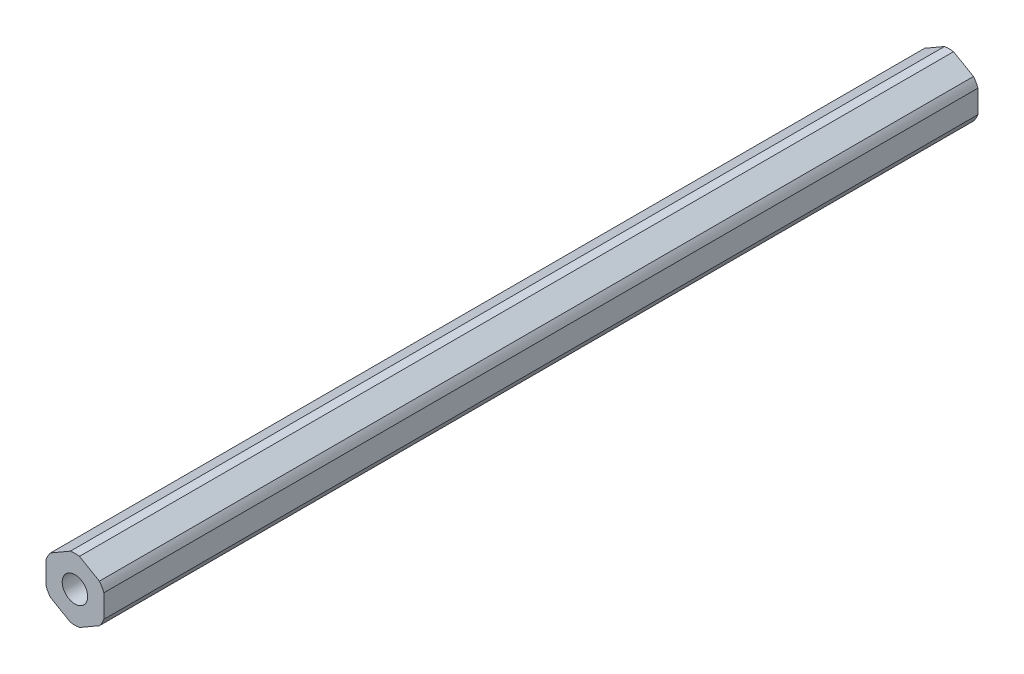
ISO-10303-21;
HEADER;
FILE_DESCRIPTION(('STEP AP214'),'2;1');
FILE_NAME('part.step','',(''),(''),'','','');
FILE_SCHEMA(('AUTOMOTIVE_DESIGN { 1 0 10303 214 1 1 1 1 }'));
ENDSEC;
DATA;
#1=APPLICATION_CONTEXT('core data for automotive mechanical design processes');
#2=APPLICATION_PROTOCOL_DEFINITION('international standard','automotive_design',2000,#1);
#3=PRODUCT_CONTEXT('',#1,'mechanical');
#4=PRODUCT('Part','Part','',(#3));
#5=PRODUCT_RELATED_PRODUCT_CATEGORY('part','',(#4));
#6=PRODUCT_DEFINITION_FORMATION('','',#4);
#7=PRODUCT_DEFINITION_CONTEXT('part definition',#1,'design');
#8=PRODUCT_DEFINITION('design','',#6,#7);
#9=PRODUCT_DEFINITION_SHAPE('','',#8);
#10=(LENGTH_UNIT() NAMED_UNIT(*) SI_UNIT(.MILLI.,.METRE.));
#11=(NAMED_UNIT(*) PLANE_ANGLE_UNIT() SI_UNIT($,.RADIAN.));
#12=(NAMED_UNIT(*) SI_UNIT($,.STERADIAN.) SOLID_ANGLE_UNIT());
#13=UNCERTAINTY_MEASURE_WITH_UNIT(LENGTH_MEASURE(1.E-05),#10,'distance_accuracy_value','');
#14=(GEOMETRIC_REPRESENTATION_CONTEXT(3) GLOBAL_UNCERTAINTY_ASSIGNED_CONTEXT((#13)) GLOBAL_UNIT_ASSIGNED_CONTEXT((#10,
#11,#12)) REPRESENTATION_CONTEXT('',''));
#15=CARTESIAN_POINT('',(0.,0.,0.));
#16=DIRECTION('',(0.,0.,1.));
#17=DIRECTION('',(1.,0.,0.));
#18=AXIS2_PLACEMENT_3D('',#15,#16,#17);
#19=CARTESIAN_POINT('',(4.7625,2.74963065701559,457.2));
#20=DIRECTION('',(-0.5,-0.866025403784439,0.));
#21=DIRECTION('',(0.866025403784439,-0.5,0.));
#22=AXIS2_PLACEMENT_3D('',#19,#20,#21);
#23=PLANE('',#22);
#24=DIRECTION('',(0.,0.,-1.));
#25=VECTOR('',#24,1.);
#26=CARTESIAN_POINT('',(4.01952231081252,3.17858902586987,457.2));
#27=LINE('',#26,#25);
#28=CARTESIAN_POINT('',(4.01952231081252,3.17858902586987,-71.9105000000002));
#29=VERTEX_POINT('',#28);
#30=CARTESIAN_POINT('',(4.01952231081252,3.17858902586987,71.9104999999997));
#31=VERTEX_POINT('',#30);
#32=EDGE_CURVE('E50',#29,#31,#27,.F.);
#33=ORIENTED_EDGE('',*,*,#32,.F.);
#34=DIRECTION('',(-0.866025403784439,0.5,0.));
#35=VECTOR('',#34,1.);
#36=CARTESIAN_POINT('',(4.7625,2.74963065701559,-71.9105000000002));
#37=LINE('',#36,#35);
#38=CARTESIAN_POINT('',(0.742977689187476,5.07030294517691,-71.9105000000002));
#39=VERTEX_POINT('',#38);
#40=EDGE_CURVE('E175',#29,#39,#37,.T.);
#41=ORIENTED_EDGE('',*,*,#40,.T.);
#42=DIRECTION('',(0.,0.,-1.));
#43=VECTOR('',#42,1.);
#44=CARTESIAN_POINT('',(0.742977689187476,5.07030294517691,457.2));
#45=LINE('',#44,#43);
#46=CARTESIAN_POINT('',(0.742977689187476,5.07030294517691,71.9104999999997));
#47=VERTEX_POINT('',#46);
#48=EDGE_CURVE('E12',#47,#39,#45,.T.);
#49=ORIENTED_EDGE('',*,*,#48,.F.);
#50=DIRECTION('',(0.866025403784439,-0.5,0.));
#51=VECTOR('',#50,1.);
#52=CARTESIAN_POINT('',(4.7625,2.74963065701559,71.9104999999997));
#53=LINE('',#52,#51);
#54=EDGE_CURVE('E223',#47,#31,#53,.T.);
#55=ORIENTED_EDGE('',*,*,#54,.T.);
#56=EDGE_LOOP('',(#33,#41,#49,#55));
#57=FACE_BOUND('',#56,.T.);
#58=ADVANCED_FACE('F41',(#57),#23,.F.);
#59=CARTESIAN_POINT('',(0.,5.49926131403119,457.2));
#60=DIRECTION('',(0.5,-0.866025403784439,0.));
#61=DIRECTION('',(0.866025403784439,0.5,0.));
#62=AXIS2_PLACEMENT_3D('',#59,#60,#61);
#63=PLANE('',#62);
#64=DIRECTION('',(0.,0.,-1.));
#65=VECTOR('',#64,1.);
#66=CARTESIAN_POINT('',(-0.742977689187483,5.07030294517691,457.2));
#67=LINE('',#66,#65);
#68=CARTESIAN_POINT('',(-0.742977689187483,5.07030294517691,-71.9105000000002));
#69=VERTEX_POINT('',#68);
#70=CARTESIAN_POINT('',(-0.742977689187483,5.07030294517691,71.9104999999997));
#71=VERTEX_POINT('',#70);
#72=EDGE_CURVE('E283',#69,#71,#67,.F.);
#73=ORIENTED_EDGE('',*,*,#72,.F.);
#74=DIRECTION('',(-0.866025403784439,-0.5,0.));
#75=VECTOR('',#74,1.);
#76=CARTESIAN_POINT('',(0.,5.49926131403119,-71.9105000000002));
#77=LINE('',#76,#75);
#78=CARTESIAN_POINT('',(-4.01952231081252,3.17858902586987,-71.9105000000002));
#79=VERTEX_POINT('',#78);
#80=EDGE_CURVE('E197',#69,#79,#77,.T.);
#81=ORIENTED_EDGE('',*,*,#80,.T.);
#82=DIRECTION('',(0.,0.,-1.));
#83=VECTOR('',#82,1.);
#84=CARTESIAN_POINT('',(-4.01952231081252,3.17858902586987,457.2));
#85=LINE('',#84,#83);
#86=CARTESIAN_POINT('',(-4.01952231081252,3.17858902586987,71.9104999999997));
#87=VERTEX_POINT('',#86);
#88=EDGE_CURVE('E286',#87,#79,#85,.T.);
#89=ORIENTED_EDGE('',*,*,#88,.F.);
#90=DIRECTION('',(0.866025403784439,0.5,0.));
#91=VECTOR('',#90,1.);
#92=CARTESIAN_POINT('',(0.,5.49926131403119,71.9104999999997));
#93=LINE('',#92,#91);
#94=EDGE_CURVE('E238',#87,#71,#93,.T.);
#95=ORIENTED_EDGE('',*,*,#94,.T.);
#96=EDGE_LOOP('',(#73,#81,#89,#95));
#97=FACE_BOUND('',#96,.T.);
#98=ADVANCED_FACE('F310',(#97),#63,.F.);
#99=CARTESIAN_POINT('',(-4.7625,2.74963065701559,457.2));
#100=DIRECTION('',(1.,0.,0.));
#101=DIRECTION('',(0.,0.,-1.));
#102=AXIS2_PLACEMENT_3D('',#99,#100,#101);
#103=PLANE('',#102);
#104=DIRECTION('',(0.,0.,-1.));
#105=VECTOR('',#104,1.);
#106=CARTESIAN_POINT('',(-4.7625,1.89171391930704,457.2));
#107=LINE('',#106,#105);
#108=CARTESIAN_POINT('',(-4.7625,1.89171391930704,-71.9105000000002));
#109=VERTEX_POINT('',#108);
#110=CARTESIAN_POINT('',(-4.7625,1.89171391930704,71.9104999999997));
#111=VERTEX_POINT('',#110);
#112=EDGE_CURVE('E276',#109,#111,#107,.F.);
#113=ORIENTED_EDGE('',*,*,#112,.F.);
#114=DIRECTION('',(0.,-1.,0.));
#115=VECTOR('',#114,1.);
#116=CARTESIAN_POINT('',(-4.7625,2.74963065701559,-71.9105000000002));
#117=LINE('',#116,#115);
#118=CARTESIAN_POINT('',(-4.7625,-1.89171391930704,-71.9105000000002));
#119=VERTEX_POINT('',#118);
#120=EDGE_CURVE('E210',#109,#119,#117,.T.);
#121=ORIENTED_EDGE('',*,*,#120,.T.);
#122=DIRECTION('',(0.,0.,-1.));
#123=VECTOR('',#122,1.);
#124=CARTESIAN_POINT('',(-4.7625,-1.89171391930704,457.2));
#125=LINE('',#124,#123);
#126=CARTESIAN_POINT('',(-4.7625,-1.89171391930704,71.9104999999997));
#127=VERTEX_POINT('',#126);
#128=EDGE_CURVE('E279',#127,#119,#125,.T.);
#129=ORIENTED_EDGE('',*,*,#128,.F.);
#130=DIRECTION('',(0.,1.,0.));
#131=VECTOR('',#130,1.);
#132=CARTESIAN_POINT('',(-4.7625,2.74963065701559,71.9104999999997));
#133=LINE('',#132,#131);
#134=EDGE_CURVE('E254',#127,#111,#133,.T.);
#135=ORIENTED_EDGE('',*,*,#134,.T.);
#136=EDGE_LOOP('',(#113,#121,#129,#135));
#137=FACE_BOUND('',#136,.T.);
#138=ADVANCED_FACE('F315',(#137),#103,.F.);
#139=CARTESIAN_POINT('',(-4.7625,-2.74963065701559,457.2));
#140=DIRECTION('',(0.5,0.866025403784439,0.));
#141=DIRECTION('',(-0.866025403784439,0.5,0.));
#142=AXIS2_PLACEMENT_3D('',#139,#140,#141);
#143=PLANE('',#142);
#144=DIRECTION('',(0.,0.,-1.));
#145=VECTOR('',#144,1.);
#146=CARTESIAN_POINT('',(-4.01952231081252,-3.17858902586987,457.2));
#147=LINE('',#146,#145);
#148=CARTESIAN_POINT('',(-4.01952231081252,-3.17858902586987,-71.9105000000002));
#149=VERTEX_POINT('',#148);
#150=CARTESIAN_POINT('',(-4.01952231081252,-3.17858902586987,71.9104999999997));
#151=VERTEX_POINT('',#150);
#152=EDGE_CURVE('E269',#149,#151,#147,.F.);
#153=ORIENTED_EDGE('',*,*,#152,.F.);
#154=DIRECTION('',(0.866025403784439,-0.5,0.));
#155=VECTOR('',#154,1.);
#156=CARTESIAN_POINT('',(-4.7625,-2.74963065701559,-71.9105000000002));
#157=LINE('',#156,#155);
#158=CARTESIAN_POINT('',(-0.742977689187479,-5.07030294517691,-71.9105000000002));
#159=VERTEX_POINT('',#158);
#160=EDGE_CURVE('E207',#149,#159,#157,.T.);
#161=ORIENTED_EDGE('',*,*,#160,.T.);
#162=DIRECTION('',(0.,0.,-1.));
#163=VECTOR('',#162,1.);
#164=CARTESIAN_POINT('',(-0.742977689187479,-5.07030294517691,457.2));
#165=LINE('',#164,#163);
#166=CARTESIAN_POINT('',(-0.742977689187479,-5.07030294517691,71.9104999999997));
#167=VERTEX_POINT('',#166);
#168=EDGE_CURVE('E272',#167,#159,#165,.T.);
#169=ORIENTED_EDGE('',*,*,#168,.F.);
#170=DIRECTION('',(-0.866025403784439,0.5,0.));
#171=VECTOR('',#170,1.);
#172=CARTESIAN_POINT('',(-4.7625,-2.74963065701559,71.9104999999997));
#173=LINE('',#172,#171);
#174=EDGE_CURVE('E250',#167,#151,#173,.T.);
#175=ORIENTED_EDGE('',*,*,#174,.T.);
#176=EDGE_LOOP('',(#153,#161,#169,#175));
#177=FACE_BOUND('',#176,.T.);
#178=ADVANCED_FACE('F328',(#177),#143,.F.);
#179=CARTESIAN_POINT('',(0.,-5.49926131403119,457.2));
#180=DIRECTION('',(-0.5,0.866025403784439,0.));
#181=DIRECTION('',(-0.866025403784439,-0.5,0.));
#182=AXIS2_PLACEMENT_3D('',#179,#180,#181);
#183=PLANE('',#182);
#184=DIRECTION('',(0.,0.,-1.));
#185=VECTOR('',#184,1.);
#186=CARTESIAN_POINT('',(0.742977689187475,-5.07030294517691,457.2));
#187=LINE('',#186,#185);
#188=CARTESIAN_POINT('',(0.742977689187475,-5.07030294517691,-71.9105000000002));
#189=VERTEX_POINT('',#188);
#190=CARTESIAN_POINT('',(0.742977689187475,-5.07030294517691,71.9104999999997));
#191=VERTEX_POINT('',#190);
#192=EDGE_CURVE('E167',#189,#191,#187,.F.);
#193=ORIENTED_EDGE('',*,*,#192,.F.);
#194=DIRECTION('',(0.866025403784439,0.5,0.));
#195=VECTOR('',#194,1.);
#196=CARTESIAN_POINT('',(0.,-5.49926131403119,-71.9105000000002));
#197=LINE('',#196,#195);
#198=CARTESIAN_POINT('',(4.01952231081252,-3.17858902586987,-71.9105000000002));
#199=VERTEX_POINT('',#198);
#200=EDGE_CURVE('E71',#189,#199,#197,.T.);
#201=ORIENTED_EDGE('',*,*,#200,.T.);
#202=DIRECTION('',(0.,0.,-1.));
#203=VECTOR('',#202,1.);
#204=CARTESIAN_POINT('',(4.01952231081252,-3.17858902586987,457.2));
#205=LINE('',#204,#203);
#206=CARTESIAN_POINT('',(4.01952231081252,-3.17858902586987,71.9104999999997));
#207=VERTEX_POINT('',#206);
#208=EDGE_CURVE('E266',#207,#199,#205,.T.);
#209=ORIENTED_EDGE('',*,*,#208,.F.);
#210=DIRECTION('',(-0.866025403784439,-0.5,0.));
#211=VECTOR('',#210,1.);
#212=CARTESIAN_POINT('',(0.,-5.49926131403119,71.9104999999997));
#213=LINE('',#212,#211);
#214=EDGE_CURVE('E234',#207,#191,#213,.T.);
#215=ORIENTED_EDGE('',*,*,#214,.T.);
#216=EDGE_LOOP('',(#193,#201,#209,#215));
#217=FACE_BOUND('',#216,.T.);
#218=ADVANCED_FACE('F321',(#217),#183,.F.);
#219=CARTESIAN_POINT('',(4.7625,-2.7496306570156,457.2));
#220=DIRECTION('',(-1.,0.,0.));
#221=DIRECTION('',(0.,-1.,0.));
#222=AXIS2_PLACEMENT_3D('',#219,#220,#221);
#223=PLANE('',#222);
#224=DIRECTION('',(0.,0.,-1.));
#225=VECTOR('',#224,1.);
#226=CARTESIAN_POINT('',(4.7625,-1.89171391930704,457.2));
#227=LINE('',#226,#225);
#228=CARTESIAN_POINT('',(4.7625,-1.89171391930704,-71.9105000000002));
#229=VERTEX_POINT('',#228);
#230=CARTESIAN_POINT('',(4.7625,-1.89171391930704,71.9104999999997));
#231=VERTEX_POINT('',#230);
#232=EDGE_CURVE('E168',#229,#231,#227,.F.);
#233=ORIENTED_EDGE('',*,*,#232,.F.);
#234=DIRECTION('',(0.,1.,0.));
#235=VECTOR('',#234,1.);
#236=CARTESIAN_POINT('',(4.7625,-2.7496306570156,-71.9105000000002));
#237=LINE('',#236,#235);
#238=CARTESIAN_POINT('',(4.7625,1.89171391930704,-71.9105000000002));
#239=VERTEX_POINT('',#238);
#240=EDGE_CURVE('E171',#229,#239,#237,.T.);
#241=ORIENTED_EDGE('',*,*,#240,.T.);
#242=DIRECTION('',(0.,0.,-1.));
#243=VECTOR('',#242,1.);
#244=CARTESIAN_POINT('',(4.7625,1.89171391930704,457.2));
#245=LINE('',#244,#243);
#246=CARTESIAN_POINT('',(4.7625,1.89171391930704,71.9104999999997));
#247=VERTEX_POINT('',#246);
#248=EDGE_CURVE('E155',#247,#239,#245,.T.);
#249=ORIENTED_EDGE('',*,*,#248,.F.);
#250=DIRECTION('',(0.,-1.,0.));
#251=VECTOR('',#250,1.);
#252=CARTESIAN_POINT('',(4.7625,-2.7496306570156,71.9104999999997));
#253=LINE('',#252,#251);
#254=EDGE_CURVE('E220',#247,#231,#253,.T.);
#255=ORIENTED_EDGE('',*,*,#254,.T.);
#256=EDGE_LOOP('',(#233,#241,#249,#255));
#257=FACE_BOUND('',#256,.T.);
#258=ADVANCED_FACE('F172',(#257),#223,.F.);
#259=CARTESIAN_POINT('',(0.,0.,457.2));
#260=DIRECTION('',(0.,0.,-1.));
#261=DIRECTION('',(-1.,0.,0.));
#262=AXIS2_PLACEMENT_3D('',#259,#260,#261);
#263=CYLINDRICAL_SURFACE('',#262,5.12445);
#264=CARTESIAN_POINT('',(0.,0.,-71.9105000000002));
#265=DIRECTION('',(0.,0.,1.));
#266=DIRECTION('',(1.,0.,0.));
#267=AXIS2_PLACEMENT_3D('',#264,#265,#266);
#268=CIRCLE('',#267,5.12445);
#269=EDGE_CURVE('E61',#229,#199,#268,.F.);
#270=ORIENTED_EDGE('',*,*,#269,.F.);
#271=ORIENTED_EDGE('',*,*,#232,.T.);
#272=CARTESIAN_POINT('',(0.,0.,71.9104999999997));
#273=DIRECTION('',(0.,0.,-1.));
#274=DIRECTION('',(-1.,0.,0.));
#275=AXIS2_PLACEMENT_3D('',#272,#273,#274);
#276=CIRCLE('',#275,5.12445);
#277=EDGE_CURVE('E231',#207,#231,#276,.F.);
#278=ORIENTED_EDGE('',*,*,#277,.F.);
#279=ORIENTED_EDGE('',*,*,#208,.T.);
#280=EDGE_LOOP('',(#270,#271,#278,#279));
#281=FACE_BOUND('',#280,.T.);
#282=ADVANCED_FACE('F320',(#281),#263,.T.);
#283=CARTESIAN_POINT('',(0.,0.,-71.9105000000002));
#284=DIRECTION('',(0.,0.,1.));
#285=DIRECTION('',(1.,0.,0.));
#286=AXIS2_PLACEMENT_3D('',#283,#284,#285);
#287=CIRCLE('',#286,5.12445);
#288=EDGE_CURVE('E203',#189,#159,#287,.F.);
#289=ORIENTED_EDGE('',*,*,#288,.F.);
#290=ORIENTED_EDGE('',*,*,#192,.T.);
#291=CARTESIAN_POINT('',(0.,0.,71.9104999999997));
#292=DIRECTION('',(0.,0.,-1.));
#293=DIRECTION('',(-1.,0.,0.));
#294=AXIS2_PLACEMENT_3D('',#291,#292,#293);
#295=CIRCLE('',#294,5.12445);
#296=EDGE_CURVE('E246',#167,#191,#295,.F.);
#297=ORIENTED_EDGE('',*,*,#296,.F.);
#298=ORIENTED_EDGE('',*,*,#168,.T.);
#299=EDGE_LOOP('',(#289,#290,#297,#298));
#300=FACE_BOUND('',#299,.T.);
#301=ADVANCED_FACE('F325',(#300),#263,.T.);
#302=CARTESIAN_POINT('',(0.,0.,-71.9105000000002));
#303=DIRECTION('',(0.,0.,1.));
#304=DIRECTION('',(1.,0.,0.));
#305=AXIS2_PLACEMENT_3D('',#302,#303,#304);
#306=CIRCLE('',#305,5.12445);
#307=EDGE_CURVE('E213',#149,#119,#306,.F.);
#308=ORIENTED_EDGE('',*,*,#307,.F.);
#309=ORIENTED_EDGE('',*,*,#152,.T.);
#310=CARTESIAN_POINT('',(0.,0.,71.9104999999997));
#311=DIRECTION('',(0.,0.,-1.));
#312=DIRECTION('',(-1.,0.,0.));
#313=AXIS2_PLACEMENT_3D('',#310,#311,#312);
#314=CIRCLE('',#313,5.12445);
#315=EDGE_CURVE('E258',#127,#151,#314,.F.);
#316=ORIENTED_EDGE('',*,*,#315,.F.);
#317=ORIENTED_EDGE('',*,*,#128,.T.);
#318=EDGE_LOOP('',(#308,#309,#316,#317));
#319=FACE_BOUND('',#318,.T.);
#320=ADVANCED_FACE('F331',(#319),#263,.T.);
#321=CARTESIAN_POINT('',(0.,0.,-71.9105000000002));
#322=DIRECTION('',(0.,0.,1.));
#323=DIRECTION('',(1.,0.,0.));
#324=AXIS2_PLACEMENT_3D('',#321,#322,#323);
#325=CIRCLE('',#324,5.12445);
#326=EDGE_CURVE('E200',#109,#79,#325,.F.);
#327=ORIENTED_EDGE('',*,*,#326,.F.);
#328=ORIENTED_EDGE('',*,*,#112,.T.);
#329=CARTESIAN_POINT('',(0.,0.,71.9104999999997));
#330=DIRECTION('',(0.,0.,-1.));
#331=DIRECTION('',(-1.,0.,0.));
#332=AXIS2_PLACEMENT_3D('',#329,#330,#331);
#333=CIRCLE('',#332,5.12445);
#334=EDGE_CURVE('E242',#87,#111,#333,.F.);
#335=ORIENTED_EDGE('',*,*,#334,.F.);
#336=ORIENTED_EDGE('',*,*,#88,.T.);
#337=EDGE_LOOP('',(#327,#328,#335,#336));
#338=FACE_BOUND('',#337,.T.);
#339=ADVANCED_FACE('F338',(#338),#263,.T.);
#340=CARTESIAN_POINT('',(0.,0.,-71.9105000000002));
#341=DIRECTION('',(0.,0.,1.));
#342=DIRECTION('',(1.,0.,0.));
#343=AXIS2_PLACEMENT_3D('',#340,#341,#342);
#344=CIRCLE('',#343,5.12445);
#345=EDGE_CURVE('E190',#69,#39,#344,.F.);
#346=ORIENTED_EDGE('',*,*,#345,.F.);
#347=ORIENTED_EDGE('',*,*,#72,.T.);
#348=CARTESIAN_POINT('',(0.,0.,71.9104999999997));
#349=DIRECTION('',(0.,0.,-1.));
#350=DIRECTION('',(-1.,0.,0.));
#351=AXIS2_PLACEMENT_3D('',#348,#349,#350);
#352=CIRCLE('',#351,5.12445);
#353=EDGE_CURVE('E227',#47,#71,#352,.F.);
#354=ORIENTED_EDGE('',*,*,#353,.F.);
#355=ORIENTED_EDGE('',*,*,#48,.T.);
#356=EDGE_LOOP('',(#346,#347,#354,#355));
#357=FACE_BOUND('',#356,.T.);
#358=ADVANCED_FACE('F342',(#357),#263,.T.);
#359=CARTESIAN_POINT('',(0.,0.,-71.9105000000002));
#360=DIRECTION('',(0.,0.,1.));
#361=DIRECTION('',(1.,0.,0.));
#362=AXIS2_PLACEMENT_3D('',#359,#360,#361);
#363=CIRCLE('',#362,5.12445);
#364=EDGE_CURVE('E159',#29,#239,#363,.F.);
#365=ORIENTED_EDGE('',*,*,#364,.F.);
#366=ORIENTED_EDGE('',*,*,#32,.T.);
#367=CARTESIAN_POINT('',(0.,0.,71.9104999999997));
#368=DIRECTION('',(0.,0.,-1.));
#369=DIRECTION('',(-1.,0.,0.));
#370=AXIS2_PLACEMENT_3D('',#367,#368,#369);
#371=CIRCLE('',#370,5.12445);
#372=EDGE_CURVE('E162',#247,#31,#371,.F.);
#373=ORIENTED_EDGE('',*,*,#372,.F.);
#374=ORIENTED_EDGE('',*,*,#248,.T.);
#375=EDGE_LOOP('',(#365,#366,#373,#374));
#376=FACE_BOUND('',#375,.T.);
#377=ADVANCED_FACE('F157',(#376),#263,.T.);
#378=CARTESIAN_POINT('',(0.,0.,457.2));
#379=DIRECTION('',(0.,0.,-1.));
#380=DIRECTION('',(-1.,0.,0.));
#381=AXIS2_PLACEMENT_3D('',#378,#379,#380);
#382=CYLINDRICAL_SURFACE('',#381,2.0955);
#383=CARTESIAN_POINT('',(0.,0.,-71.9105000000002));
#384=DIRECTION('',(0.,0.,1.));
#385=DIRECTION('',(1.,0.,0.));
#386=AXIS2_PLACEMENT_3D('',#383,#384,#385);
#387=CIRCLE('',#386,2.0955);
#388=CARTESIAN_POINT('',(2.0955,0.,-71.9105000000002));
#389=VERTEX_POINT('',#388);
#390=EDGE_CURVE('E44',#389,#389,#387,.F.);
#391=ORIENTED_EDGE('',*,*,#390,.T.);
#392=EDGE_LOOP('',(#391));
#393=FACE_BOUND('',#392,.T.);
#394=CARTESIAN_POINT('',(0.,0.,71.9104999999997));
#395=DIRECTION('',(0.,0.,-1.));
#396=DIRECTION('',(-1.,0.,0.));
#397=AXIS2_PLACEMENT_3D('',#394,#395,#396);
#398=CIRCLE('',#397,2.0955);
#399=CARTESIAN_POINT('',(-2.0955,0.,71.9104999999997));
#400=VERTEX_POINT('',#399);
#401=EDGE_CURVE('E217',#400,#400,#398,.F.);
#402=ORIENTED_EDGE('',*,*,#401,.T.);
#403=EDGE_LOOP('',(#402));
#404=FACE_BOUND('',#403,.T.);
#405=ADVANCED_FACE('F295',(#393,#404),#382,.F.);
#406=CARTESIAN_POINT('',(1.02222804350093E-13,0.,71.9104999999996));
#407=DIRECTION('',(0.,0.,-1.));
#408=DIRECTION('',(-1.,0.,0.));
#409=AXIS2_PLACEMENT_3D('',#406,#407,#408);
#410=PLANE('',#409);
#411=ORIENTED_EDGE('',*,*,#134,.F.);
#412=ORIENTED_EDGE('',*,*,#315,.T.);
#413=ORIENTED_EDGE('',*,*,#174,.F.);
#414=ORIENTED_EDGE('',*,*,#296,.T.);
#415=ORIENTED_EDGE('',*,*,#214,.F.);
#416=ORIENTED_EDGE('',*,*,#277,.T.);
#417=ORIENTED_EDGE('',*,*,#254,.F.);
#418=ORIENTED_EDGE('',*,*,#372,.T.);
#419=ORIENTED_EDGE('',*,*,#54,.F.);
#420=ORIENTED_EDGE('',*,*,#353,.T.);
#421=ORIENTED_EDGE('',*,*,#94,.F.);
#422=ORIENTED_EDGE('',*,*,#334,.T.);
#423=EDGE_LOOP('',(#411,#412,#413,#414,#415,#416,#417,#418,#419,#420,#421,#422));
#424=FACE_BOUND('',#423,.T.);
#425=ORIENTED_EDGE('',*,*,#401,.F.);
#426=EDGE_LOOP('',(#425));
#427=FACE_BOUND('',#426,.T.);
#428=ADVANCED_FACE('F297',(#424,#427),#410,.F.);
#429=CARTESIAN_POINT('',(0.,0.,-71.9105000000001));
#430=DIRECTION('',(0.,0.,1.));
#431=DIRECTION('',(1.,0.,0.));
#432=AXIS2_PLACEMENT_3D('',#429,#430,#431);
#433=PLANE('',#432);
#434=ORIENTED_EDGE('',*,*,#160,.F.);
#435=ORIENTED_EDGE('',*,*,#307,.T.);
#436=ORIENTED_EDGE('',*,*,#120,.F.);
#437=ORIENTED_EDGE('',*,*,#326,.T.);
#438=ORIENTED_EDGE('',*,*,#80,.F.);
#439=ORIENTED_EDGE('',*,*,#345,.T.);
#440=ORIENTED_EDGE('',*,*,#40,.F.);
#441=ORIENTED_EDGE('',*,*,#364,.T.);
#442=ORIENTED_EDGE('',*,*,#240,.F.);
#443=ORIENTED_EDGE('',*,*,#269,.T.);
#444=ORIENTED_EDGE('',*,*,#200,.F.);
#445=ORIENTED_EDGE('',*,*,#288,.T.);
#446=EDGE_LOOP('',(#434,#435,#436,#437,#438,#439,#440,#441,#442,#443,#444,#445));
#447=FACE_BOUND('',#446,.T.);
#448=ORIENTED_EDGE('',*,*,#390,.F.);
#449=EDGE_LOOP('',(#448));
#450=FACE_BOUND('',#449,.T.);
#451=ADVANCED_FACE('F179',(#447,#450),#433,.F.);
#452=CLOSED_SHELL('',(#58,#98,#138,#178,#218,#258,#282,#301,#320,#339,#358,#377,#405,#428,#451));
#453=MANIFOLD_SOLID_BREP('B2',#452);
#454=ADVANCED_BREP_SHAPE_REPRESENTATION('',(#18,#453),#14);
#455=SHAPE_DEFINITION_REPRESENTATION(#9,#454);
ENDSEC;
END-ISO-10303-21;
